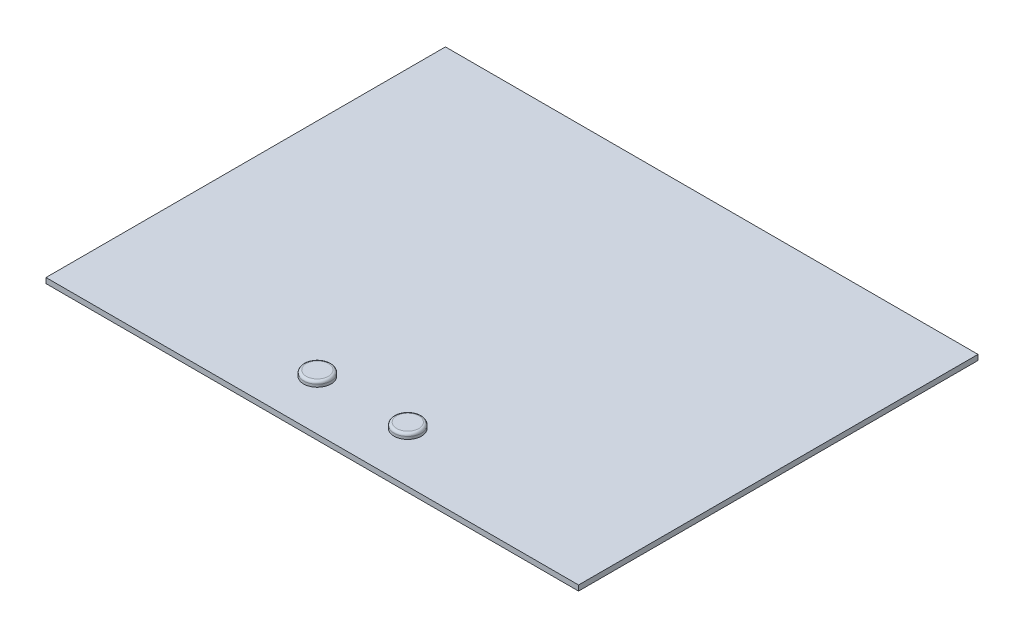
ISO-10303-21;
HEADER;
FILE_DESCRIPTION(('STEP AP214'),'2;1');
FILE_NAME('part.step','',(''),(''),'','','');
FILE_SCHEMA(('AUTOMOTIVE_DESIGN { 1 0 10303 214 1 1 1 1 }'));
ENDSEC;
DATA;
#1=APPLICATION_CONTEXT('core data for automotive mechanical design processes');
#2=APPLICATION_PROTOCOL_DEFINITION('international standard','automotive_design',2000,#1);
#3=PRODUCT_CONTEXT('',#1,'mechanical');
#4=PRODUCT('Part','Part','',(#3));
#5=PRODUCT_RELATED_PRODUCT_CATEGORY('part','',(#4));
#6=PRODUCT_DEFINITION_FORMATION('','',#4);
#7=PRODUCT_DEFINITION_CONTEXT('part definition',#1,'design');
#8=PRODUCT_DEFINITION('design','',#6,#7);
#9=PRODUCT_DEFINITION_SHAPE('','',#8);
#10=(LENGTH_UNIT() NAMED_UNIT(*) SI_UNIT(.MILLI.,.METRE.));
#11=(NAMED_UNIT(*) PLANE_ANGLE_UNIT() SI_UNIT($,.RADIAN.));
#12=(NAMED_UNIT(*) SI_UNIT($,.STERADIAN.) SOLID_ANGLE_UNIT());
#13=UNCERTAINTY_MEASURE_WITH_UNIT(LENGTH_MEASURE(1.E-05),#10,'distance_accuracy_value','');
#14=(GEOMETRIC_REPRESENTATION_CONTEXT(3) GLOBAL_UNCERTAINTY_ASSIGNED_CONTEXT((#13)) GLOBAL_UNIT_ASSIGNED_CONTEXT((#10,
#11,#12)) REPRESENTATION_CONTEXT('',''));
#15=CARTESIAN_POINT('',(0.,0.,0.));
#16=DIRECTION('',(0.,0.,1.));
#17=DIRECTION('',(1.,0.,0.));
#18=AXIS2_PLACEMENT_3D('',#15,#16,#17);
#19=CARTESIAN_POINT('',(0.,0.4,0.));
#20=DIRECTION('',(1.,0.,0.));
#21=DIRECTION('',(0.,0.,-1.));
#22=AXIS2_PLACEMENT_3D('',#19,#20,#21);
#23=PLANE('',#22);
#24=DIRECTION('',(0.,0.,1.));
#25=VECTOR('',#24,1.);
#26=CARTESIAN_POINT('',(0.,0.,0.));
#27=LINE('',#26,#25);
#28=CARTESIAN_POINT('',(0.,0.,-30.));
#29=VERTEX_POINT('',#28);
#30=CARTESIAN_POINT('',(0.,0.,0.));
#31=VERTEX_POINT('',#30);
#32=EDGE_CURVE('E112',#29,#31,#27,.T.);
#33=ORIENTED_EDGE('',*,*,#32,.T.);
#34=DIRECTION('',(0.,-1.,0.));
#35=VECTOR('',#34,1.);
#36=CARTESIAN_POINT('',(0.,0.4,0.));
#37=LINE('',#36,#35);
#38=CARTESIAN_POINT('',(0.,0.4,0.));
#39=VERTEX_POINT('',#38);
#40=EDGE_CURVE('E103',#39,#31,#37,.T.);
#41=ORIENTED_EDGE('',*,*,#40,.F.);
#42=DIRECTION('',(0.,0.,1.));
#43=VECTOR('',#42,1.);
#44=CARTESIAN_POINT('',(0.,0.4,0.));
#45=LINE('',#44,#43);
#46=CARTESIAN_POINT('',(0.,0.4,-30.));
#47=VERTEX_POINT('',#46);
#48=EDGE_CURVE('E97',#47,#39,#45,.T.);
#49=ORIENTED_EDGE('',*,*,#48,.F.);
#50=DIRECTION('',(0.,-1.,0.));
#51=VECTOR('',#50,1.);
#52=CARTESIAN_POINT('',(0.,0.4,-30.));
#53=LINE('',#52,#51);
#54=EDGE_CURVE('E108',#47,#29,#53,.T.);
#55=ORIENTED_EDGE('',*,*,#54,.T.);
#56=EDGE_LOOP('',(#33,#41,#49,#55));
#57=FACE_BOUND('',#56,.T.);
#58=ADVANCED_FACE('F44',(#57),#23,.F.);
#59=CARTESIAN_POINT('',(0.,0.4,0.));
#60=DIRECTION('',(0.,0.,-1.));
#61=DIRECTION('',(-1.,0.,0.));
#62=AXIS2_PLACEMENT_3D('',#59,#60,#61);
#63=PLANE('',#62);
#64=DIRECTION('',(1.,0.,0.));
#65=VECTOR('',#64,1.);
#66=CARTESIAN_POINT('',(0.,0.,0.));
#67=LINE('',#66,#65);
#68=CARTESIAN_POINT('',(40.,0.,0.));
#69=VERTEX_POINT('',#68);
#70=EDGE_CURVE('E102',#31,#69,#67,.T.);
#71=ORIENTED_EDGE('',*,*,#70,.T.);
#72=DIRECTION('',(0.,-1.,0.));
#73=VECTOR('',#72,1.);
#74=CARTESIAN_POINT('',(40.,0.4,0.));
#75=LINE('',#74,#73);
#76=CARTESIAN_POINT('',(40.,0.4,0.));
#77=VERTEX_POINT('',#76);
#78=EDGE_CURVE('E100',#77,#69,#75,.T.);
#79=ORIENTED_EDGE('',*,*,#78,.F.);
#80=DIRECTION('',(1.,0.,0.));
#81=VECTOR('',#80,1.);
#82=CARTESIAN_POINT('',(0.,0.4,0.));
#83=LINE('',#82,#81);
#84=EDGE_CURVE('E92',#39,#77,#83,.T.);
#85=ORIENTED_EDGE('',*,*,#84,.F.);
#86=ORIENTED_EDGE('',*,*,#40,.T.);
#87=EDGE_LOOP('',(#71,#79,#85,#86));
#88=FACE_BOUND('',#87,.T.);
#89=ADVANCED_FACE('F101',(#88),#63,.F.);
#90=CARTESIAN_POINT('',(40.,0.4,0.));
#91=DIRECTION('',(-1.,0.,0.));
#92=DIRECTION('',(0.,0.,1.));
#93=AXIS2_PLACEMENT_3D('',#90,#91,#92);
#94=PLANE('',#93);
#95=DIRECTION('',(0.,0.,-1.));
#96=VECTOR('',#95,1.);
#97=CARTESIAN_POINT('',(40.,0.,0.));
#98=LINE('',#97,#96);
#99=CARTESIAN_POINT('',(40.,0.,-30.));
#100=VERTEX_POINT('',#99);
#101=EDGE_CURVE('E78',#69,#100,#98,.T.);
#102=ORIENTED_EDGE('',*,*,#101,.T.);
#103=DIRECTION('',(0.,-1.,0.));
#104=VECTOR('',#103,1.);
#105=CARTESIAN_POINT('',(40.,0.4,-30.));
#106=LINE('',#105,#104);
#107=CARTESIAN_POINT('',(40.,0.4,-30.));
#108=VERTEX_POINT('',#107);
#109=EDGE_CURVE('E104',#108,#100,#106,.T.);
#110=ORIENTED_EDGE('',*,*,#109,.F.);
#111=DIRECTION('',(0.,0.,-1.));
#112=VECTOR('',#111,1.);
#113=CARTESIAN_POINT('',(40.,0.4,0.));
#114=LINE('',#113,#112);
#115=EDGE_CURVE('E95',#77,#108,#114,.T.);
#116=ORIENTED_EDGE('',*,*,#115,.F.);
#117=ORIENTED_EDGE('',*,*,#78,.T.);
#118=EDGE_LOOP('',(#102,#110,#116,#117));
#119=FACE_BOUND('',#118,.T.);
#120=ADVANCED_FACE('F106',(#119),#94,.F.);
#121=CARTESIAN_POINT('',(0.,0.4,-30.));
#122=DIRECTION('',(0.,0.,1.));
#123=DIRECTION('',(1.,0.,0.));
#124=AXIS2_PLACEMENT_3D('',#121,#122,#123);
#125=PLANE('',#124);
#126=DIRECTION('',(-1.,0.,0.));
#127=VECTOR('',#126,1.);
#128=CARTESIAN_POINT('',(0.,0.,-30.));
#129=LINE('',#128,#127);
#130=EDGE_CURVE('E84',#100,#29,#129,.T.);
#131=ORIENTED_EDGE('',*,*,#130,.T.);
#132=ORIENTED_EDGE('',*,*,#54,.F.);
#133=DIRECTION('',(-1.,0.,0.));
#134=VECTOR('',#133,1.);
#135=CARTESIAN_POINT('',(0.,0.4,-30.));
#136=LINE('',#135,#134);
#137=EDGE_CURVE('E61',#108,#47,#136,.T.);
#138=ORIENTED_EDGE('',*,*,#137,.F.);
#139=ORIENTED_EDGE('',*,*,#109,.T.);
#140=EDGE_LOOP('',(#131,#132,#138,#139));
#141=FACE_BOUND('',#140,.T.);
#142=ADVANCED_FACE('F156',(#141),#125,.F.);
#143=CARTESIAN_POINT('',(0.,0.4,0.));
#144=DIRECTION('',(0.,-1.,0.));
#145=DIRECTION('',(0.,0.,-1.));
#146=AXIS2_PLACEMENT_3D('',#143,#144,#145);
#147=PLANE('',#146);
#148=CARTESIAN_POINT('',(23.3960354871179,0.4,-3.77716397616508));
#149=DIRECTION('',(0.,-1.,0.));
#150=DIRECTION('',(0.,0.,-1.));
#151=AXIS2_PLACEMENT_3D('',#148,#149,#150);
#152=CIRCLE('',#151,1.03029815212905);
#153=CARTESIAN_POINT('',(23.3960354871179,0.4,-4.80746212829413));
#154=VERTEX_POINT('',#153);
#155=EDGE_CURVE('E124',#154,#154,#152,.F.);
#156=ORIENTED_EDGE('',*,*,#155,.F.);
#157=EDGE_LOOP('',(#156));
#158=FACE_BOUND('',#157,.T.);
#159=CARTESIAN_POINT('',(16.6039645128821,0.4,-3.77716397616508));
#160=DIRECTION('',(0.,-1.,0.));
#161=DIRECTION('',(0.,0.,-1.));
#162=AXIS2_PLACEMENT_3D('',#159,#160,#161);
#163=CIRCLE('',#162,1.03029815212905);
#164=CARTESIAN_POINT('',(16.6039645128821,0.4,-4.80746212829413));
#165=VERTEX_POINT('',#164);
#166=EDGE_CURVE('E121',#165,#165,#163,.F.);
#167=ORIENTED_EDGE('',*,*,#166,.F.);
#168=EDGE_LOOP('',(#167));
#169=FACE_BOUND('',#168,.T.);
#170=ORIENTED_EDGE('',*,*,#48,.T.);
#171=ORIENTED_EDGE('',*,*,#84,.T.);
#172=ORIENTED_EDGE('',*,*,#115,.T.);
#173=ORIENTED_EDGE('',*,*,#137,.T.);
#174=EDGE_LOOP('',(#170,#171,#172,#173));
#175=FACE_BOUND('',#174,.T.);
#176=ADVANCED_FACE('F93',(#158,#169,#175),#147,.F.);
#177=CARTESIAN_POINT('',(0.,0.,0.));
#178=DIRECTION('',(0.,-1.,0.));
#179=DIRECTION('',(0.,0.,-1.));
#180=AXIS2_PLACEMENT_3D('',#177,#178,#179);
#181=PLANE('',#180);
#182=ORIENTED_EDGE('',*,*,#32,.F.);
#183=ORIENTED_EDGE('',*,*,#130,.F.);
#184=ORIENTED_EDGE('',*,*,#101,.F.);
#185=ORIENTED_EDGE('',*,*,#70,.F.);
#186=EDGE_LOOP('',(#182,#183,#184,#185));
#187=FACE_BOUND('',#186,.T.);
#188=ADVANCED_FACE('F159',(#187),#181,.T.);
#189=CARTESIAN_POINT('',(16.6039645128821,0.8,-3.77716397616508));
#190=DIRECTION('',(0.,-1.,0.));
#191=DIRECTION('',(0.,0.,-1.));
#192=AXIS2_PLACEMENT_3D('',#189,#190,#191);
#193=CYLINDRICAL_SURFACE('',#192,1.03029815212905);
#194=CARTESIAN_POINT('',(16.6039645128821,0.6,-3.77716397616508));
#195=DIRECTION('',(0.,1.,0.));
#196=DIRECTION('',(0.,0.,1.));
#197=AXIS2_PLACEMENT_3D('',#194,#195,#196);
#198=CIRCLE('',#197,1.03029815212905);
#199=CARTESIAN_POINT('',(16.6039645128821,0.6,-2.74686582403603));
#200=VERTEX_POINT('',#199);
#201=EDGE_CURVE('E11',#200,#200,#198,.F.);
#202=ORIENTED_EDGE('',*,*,#201,.T.);
#203=EDGE_LOOP('',(#202));
#204=FACE_BOUND('',#203,.T.);
#205=ORIENTED_EDGE('',*,*,#166,.T.);
#206=EDGE_LOOP('',(#205));
#207=FACE_BOUND('',#206,.T.);
#208=ADVANCED_FACE('F162',(#204,#207),#193,.T.);
#209=CARTESIAN_POINT('',(16.6039645128821,0.8,-3.77716397616508));
#210=DIRECTION('',(0.,1.,0.));
#211=DIRECTION('',(0.,0.,1.));
#212=AXIS2_PLACEMENT_3D('',#209,#210,#211);
#213=PLANE('',#212);
#214=CARTESIAN_POINT('',(16.6039645128821,0.8,-3.77716397616508));
#215=DIRECTION('',(0.,1.,0.));
#216=DIRECTION('',(0.,0.,1.));
#217=AXIS2_PLACEMENT_3D('',#214,#215,#216);
#218=CIRCLE('',#217,0.830298152129049);
#219=CARTESIAN_POINT('',(16.6039645128821,0.8,-2.94686582403603));
#220=VERTEX_POINT('',#219);
#221=EDGE_CURVE('E53',#220,#220,#218,.T.);
#222=ORIENTED_EDGE('',*,*,#221,.T.);
#223=EDGE_LOOP('',(#222));
#224=FACE_BOUND('',#223,.T.);
#225=ADVANCED_FACE('F135',(#224),#213,.T.);
#226=CARTESIAN_POINT('',(23.3960354871179,0.8,-3.77716397616508));
#227=DIRECTION('',(0.,-1.,0.));
#228=DIRECTION('',(0.,0.,-1.));
#229=AXIS2_PLACEMENT_3D('',#226,#227,#228);
#230=CYLINDRICAL_SURFACE('',#229,1.03029815212905);
#231=CARTESIAN_POINT('',(23.3960354871179,0.6,-3.77716397616508));
#232=DIRECTION('',(0.,-1.,0.));
#233=DIRECTION('',(0.,0.,-1.));
#234=AXIS2_PLACEMENT_3D('',#231,#232,#233);
#235=CIRCLE('',#234,1.03029815212905);
#236=CARTESIAN_POINT('',(23.3960354871179,0.6,-4.80746212829413));
#237=VERTEX_POINT('',#236);
#238=EDGE_CURVE('E130',#237,#237,#235,.T.);
#239=ORIENTED_EDGE('',*,*,#238,.T.);
#240=EDGE_LOOP('',(#239));
#241=FACE_BOUND('',#240,.T.);
#242=ORIENTED_EDGE('',*,*,#155,.T.);
#243=EDGE_LOOP('',(#242));
#244=FACE_BOUND('',#243,.T.);
#245=ADVANCED_FACE('F172',(#241,#244),#230,.T.);
#246=CARTESIAN_POINT('',(23.3960354871179,0.8,-3.77716397616508));
#247=DIRECTION('',(0.,-1.,0.));
#248=DIRECTION('',(0.,0.,-1.));
#249=AXIS2_PLACEMENT_3D('',#246,#247,#248);
#250=PLANE('',#249);
#251=CARTESIAN_POINT('',(23.3960354871179,0.8,-3.77716397616508));
#252=DIRECTION('',(0.,-1.,0.));
#253=DIRECTION('',(0.,0.,-1.));
#254=AXIS2_PLACEMENT_3D('',#251,#252,#253);
#255=CIRCLE('',#254,0.830298152129052);
#256=CARTESIAN_POINT('',(23.3960354871179,0.8,-4.60746212829413));
#257=VERTEX_POINT('',#256);
#258=EDGE_CURVE('E127',#257,#257,#255,.F.);
#259=ORIENTED_EDGE('',*,*,#258,.T.);
#260=EDGE_LOOP('',(#259));
#261=FACE_BOUND('',#260,.T.);
#262=ADVANCED_FACE('F143',(#261),#250,.F.);
#263=CARTESIAN_POINT('',(23.3960354871179,0.6,-3.77716397616508));
#264=DIRECTION('',(0.,-1.,0.));
#265=DIRECTION('',(0.,0.,-1.));
#266=AXIS2_PLACEMENT_3D('',#263,#264,#265);
#267=TOROIDAL_SURFACE('',#266,0.830298152129052,0.2);
#268=ORIENTED_EDGE('',*,*,#238,.F.);
#269=EDGE_LOOP('',(#268));
#270=FACE_BOUND('',#269,.T.);
#271=ORIENTED_EDGE('',*,*,#258,.F.);
#272=EDGE_LOOP('',(#271));
#273=FACE_BOUND('',#272,.T.);
#274=ADVANCED_FACE('F138',(#270,#273),#267,.T.);
#275=CARTESIAN_POINT('',(16.6039645128821,0.6,-3.77716397616508));
#276=DIRECTION('',(0.,1.,0.));
#277=DIRECTION('',(0.,0.,1.));
#278=AXIS2_PLACEMENT_3D('',#275,#276,#277);
#279=TOROIDAL_SURFACE('',#278,0.830298152129049,0.2);
#280=ORIENTED_EDGE('',*,*,#201,.F.);
#281=EDGE_LOOP('',(#280));
#282=FACE_BOUND('',#281,.T.);
#283=ORIENTED_EDGE('',*,*,#221,.F.);
#284=EDGE_LOOP('',(#283));
#285=FACE_BOUND('',#284,.T.);
#286=ADVANCED_FACE('F46',(#282,#285),#279,.T.);
#287=CLOSED_SHELL('',(#58,#89,#120,#142,#176,#188,#208,#225,#245,#262,#274,#286));
#288=MANIFOLD_SOLID_BREP('B2',#287);
#289=ADVANCED_BREP_SHAPE_REPRESENTATION('',(#18,#288),#14);
#290=SHAPE_DEFINITION_REPRESENTATION(#9,#289);
ENDSEC;
END-ISO-10303-21;
